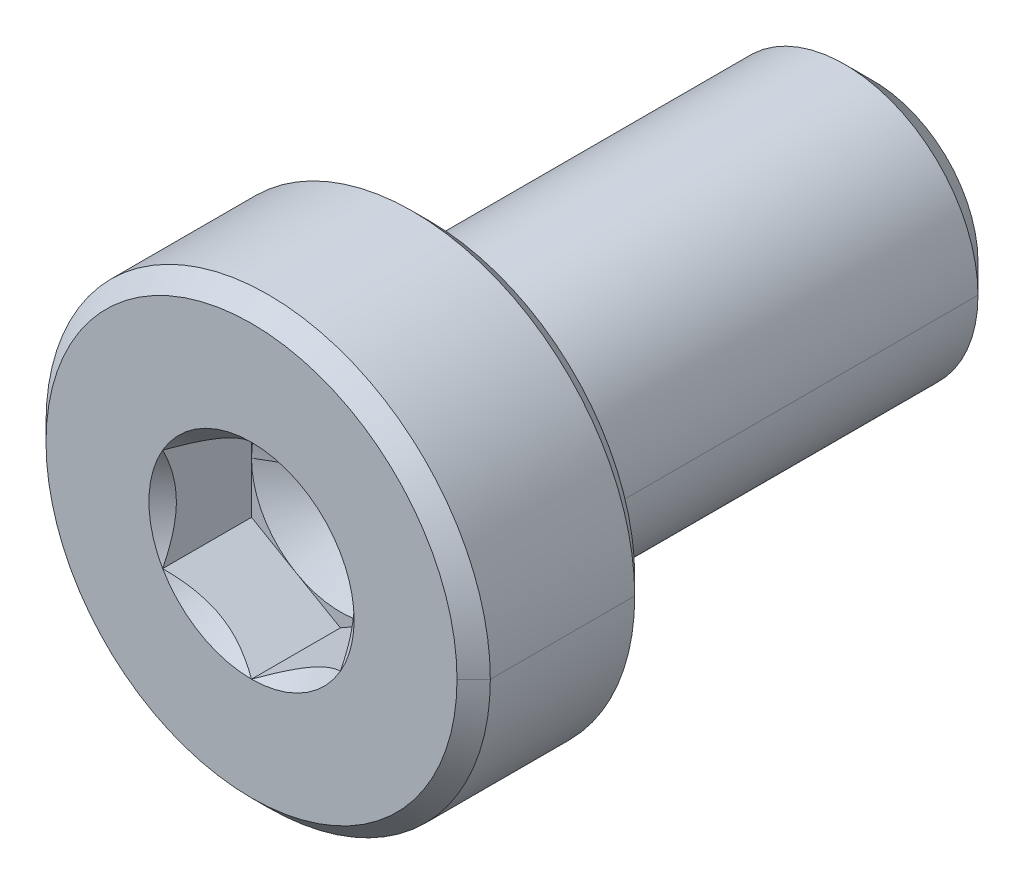
ISO-10303-21;
HEADER;
FILE_DESCRIPTION(('STEP AP214'),'2;1');
FILE_NAME('part.step','',(''),(''),'','','');
FILE_SCHEMA(('AUTOMOTIVE_DESIGN { 1 0 10303 214 1 1 1 1 }'));
ENDSEC;
DATA;
#1=APPLICATION_CONTEXT('core data for automotive mechanical design processes');
#2=APPLICATION_PROTOCOL_DEFINITION('international standard','automotive_design',2000,#1);
#3=PRODUCT_CONTEXT('',#1,'mechanical');
#4=PRODUCT('Part','Part','',(#3));
#5=PRODUCT_RELATED_PRODUCT_CATEGORY('part','',(#4));
#6=PRODUCT_DEFINITION_FORMATION('','',#4);
#7=PRODUCT_DEFINITION_CONTEXT('part definition',#1,'design');
#8=PRODUCT_DEFINITION('design','',#6,#7);
#9=PRODUCT_DEFINITION_SHAPE('','',#8);
#10=(LENGTH_UNIT() NAMED_UNIT(*) SI_UNIT(.MILLI.,.METRE.));
#11=(NAMED_UNIT(*) PLANE_ANGLE_UNIT() SI_UNIT($,.RADIAN.));
#12=(NAMED_UNIT(*) SI_UNIT($,.STERADIAN.) SOLID_ANGLE_UNIT());
#13=UNCERTAINTY_MEASURE_WITH_UNIT(LENGTH_MEASURE(1.E-05),#10,'distance_accuracy_value','');
#14=(GEOMETRIC_REPRESENTATION_CONTEXT(3) GLOBAL_UNCERTAINTY_ASSIGNED_CONTEXT((#13)) GLOBAL_UNIT_ASSIGNED_CONTEXT((#10,
#11,#12)) REPRESENTATION_CONTEXT('',''));
#15=CARTESIAN_POINT('',(0.,0.,0.));
#16=DIRECTION('',(0.,0.,1.));
#17=DIRECTION('',(1.,0.,0.));
#18=AXIS2_PLACEMENT_3D('',#15,#16,#17);
#19=CARTESIAN_POINT('',(0.,0.,4.99999999999695));
#20=DIRECTION('',(0.,0.,0.999999999999951));
#21=DIRECTION('',(0.999999999999969,0.,0.));
#22=AXIS2_PLACEMENT_3D('',#19,#20,#21);
#23=CONICAL_SURFACE('',#22,2.,1.0471975511966);
#24=DIRECTION('',(-0.866025403784412,0.,0.499999999999976));
#25=VECTOR('',#24,1.);
#26=CARTESIAN_POINT('',(-2.00000000000004,0.,4.99999999999695));
#27=LINE('',#26,#25);
#28=CARTESIAN_POINT('',(0.,0.,3.84529946161771));
#29=VERTEX_POINT('',#28);
#30=CARTESIAN_POINT('',(-2.00000000000004,0.,4.99999999999695));
#31=VERTEX_POINT('',#30);
#32=EDGE_CURVE('E401',#29,#31,#27,.T.);
#33=ORIENTED_EDGE('',*,*,#32,.F.);
#34=DIRECTION('',(0.866025403784412,0.,0.499999999999976));
#35=VECTOR('',#34,1.);
#36=CARTESIAN_POINT('',(1.99999999999997,0.,4.99999999999695));
#37=LINE('',#36,#35);
#38=CARTESIAN_POINT('',(1.99999999999997,0.,4.99999999999695));
#39=VERTEX_POINT('',#38);
#40=EDGE_CURVE('E403',#29,#39,#37,.T.);
#41=ORIENTED_EDGE('',*,*,#40,.T.);
#42=CARTESIAN_POINT('',(0.,0.,4.99999999999695));
#43=DIRECTION('',(0.,0.,0.999999999999951));
#44=DIRECTION('',(0.999999999999969,0.,0.));
#45=AXIS2_PLACEMENT_3D('',#42,#43,#44);
#46=CIRCLE('',#45,2.);
#47=CARTESIAN_POINT('',(0.999999999999987,1.73205080756891,4.99999999999695));
#48=VERTEX_POINT('',#47);
#49=EDGE_CURVE('E514',#39,#48,#46,.T.);
#50=ORIENTED_EDGE('',*,*,#49,.T.);
#51=CARTESIAN_POINT('',(0.,0.,4.99999999999695));
#52=DIRECTION('',(0.,0.,0.999999999999951));
#53=DIRECTION('',(0.999999999999969,0.,0.));
#54=AXIS2_PLACEMENT_3D('',#51,#52,#53);
#55=CIRCLE('',#54,2.);
#56=CARTESIAN_POINT('',(-1.00000000000004,1.73205080756887,4.99999999999695));
#57=VERTEX_POINT('',#56);
#58=EDGE_CURVE('E543',#48,#57,#55,.T.);
#59=ORIENTED_EDGE('',*,*,#58,.T.);
#60=CARTESIAN_POINT('',(0.,0.,4.99999999999695));
#61=DIRECTION('',(0.,0.,0.999999999999951));
#62=DIRECTION('',(0.999999999999969,0.,0.));
#63=AXIS2_PLACEMENT_3D('',#60,#61,#62);
#64=CIRCLE('',#63,2.);
#65=EDGE_CURVE('E405',#57,#31,#64,.T.);
#66=ORIENTED_EDGE('',*,*,#65,.T.);
#67=EDGE_LOOP('',(#33,#41,#50,#59,#66));
#68=FACE_BOUND('',#67,.T.);
#69=ADVANCED_FACE('F16',(#68),#23,.F.);
#70=CARTESIAN_POINT('',(0.,2.30940107675853,-1.11010092660778));
#71=DIRECTION('',(-0.499999999999985,0.866025403784411,0.));
#72=DIRECTION('',(0.,0.,0.999999999999951));
#73=AXIS2_PLACEMENT_3D('',#70,#71,#72);
#74=PLANE('',#73);
#75=DIRECTION('',(0.,0.,0.999999999999951));
#76=VECTOR('',#75,1.);
#77=CARTESIAN_POINT('',(0.,2.30940107675853,-1.11010092660778));
#78=LINE('',#77,#76);
#79=CARTESIAN_POINT('',(0.,2.30940107675853,4.99999999999695));
#80=VERTEX_POINT('',#79);
#81=CARTESIAN_POINT('',(0.,2.30940107675853,6.99999999999695));
#82=VERTEX_POINT('',#81);
#83=EDGE_CURVE('E292',#80,#82,#78,.T.);
#84=ORIENTED_EDGE('',*,*,#83,.T.);
#85=CARTESIAN_POINT('',(0.,2.30940107675853,6.99999999999961));
#86=CARTESIAN_POINT('',(-0.252681558770766,2.16351531078296,6.85411423402403));
#87=CARTESIAN_POINT('',(-0.481557611863528,2.03137365991879,6.77827147413491));
#88=CARTESIAN_POINT('',(-0.744004310413538,1.87984998786302,6.6913043944739));
#89=CARTESIAN_POINT('',(-0.996316959809336,1.7341772118144,6.69060344483097));
#90=CARTESIAN_POINT('',(-1.24817855174684,1.58876485391076,6.68990374827053));
#91=CARTESIAN_POINT('',(-1.51174853644636,1.43659265229418,6.77606819562888));
#92=CARTESIAN_POINT('',(-1.74318494981286,1.30297277673676,6.85172776164149));
#93=CARTESIAN_POINT('',(-1.99999999999982,1.15470053837937,6.99999999999961));
#94=B_SPLINE_CURVE_WITH_KNOTS('',2,(#85,#86,#87,#88,#89,#90,#91,#92,#93),.UNSPECIFIED.,.F.,.F.,
(3,2,2,2,3),(0.,0.25,0.5,0.75,1.),.UNSPECIFIED.);
#95=CARTESIAN_POINT('',(-2.00000000000001,1.15470053837926,6.99999999999695));
#96=VERTEX_POINT('',#95);
#97=EDGE_CURVE('E370',#82,#96,#94,.T.);
#98=ORIENTED_EDGE('',*,*,#97,.T.);
#99=DIRECTION('',(0.,0.,0.999999999999951));
#100=VECTOR('',#99,1.);
#101=CARTESIAN_POINT('',(-2.00000000000001,1.15470053837926,-1.11010092660778));
#102=LINE('',#101,#100);
#103=CARTESIAN_POINT('',(-2.00000000000001,1.15470053837926,4.99999999999695));
#104=VERTEX_POINT('',#103);
#105=EDGE_CURVE('E11',#104,#96,#102,.T.);
#106=ORIENTED_EDGE('',*,*,#105,.F.);
#107=DIRECTION('',(-0.866025403784411,-0.499999999999985,0.));
#108=VECTOR('',#107,1.);
#109=CARTESIAN_POINT('',(0.,2.30940107675853,4.99999999999695));
#110=LINE('',#109,#108);
#111=EDGE_CURVE('E535',#57,#104,#110,.T.);
#112=ORIENTED_EDGE('',*,*,#111,.F.);
#113=DIRECTION('',(-0.866025403784411,-0.499999999999985,0.));
#114=VECTOR('',#113,1.);
#115=CARTESIAN_POINT('',(0.,2.30940107675853,4.99999999999695));
#116=LINE('',#115,#114);
#117=EDGE_CURVE('E539',#80,#57,#116,.T.);
#118=ORIENTED_EDGE('',*,*,#117,.F.);
#119=EDGE_LOOP('',(#84,#98,#106,#112,#118));
#120=FACE_BOUND('',#119,.T.);
#121=ADVANCED_FACE('F351',(#120),#74,.F.);
#122=CARTESIAN_POINT('',(-2.00000000000001,1.15470053837926,-1.11010092660778));
#123=DIRECTION('',(-0.999999999999969,0.,0.));
#124=DIRECTION('',(0.,0.,0.999999999999951));
#125=AXIS2_PLACEMENT_3D('',#122,#123,#124);
#126=PLANE('',#125);
#127=ORIENTED_EDGE('',*,*,#105,.T.);
#128=CARTESIAN_POINT('',(-2.00000000000001,1.15470053837926,6.99999999999961));
#129=CARTESIAN_POINT('',(-2.00000000000001,0.860775765360554,6.85303761349025));
#130=CARTESIAN_POINT('',(-2.00000000000001,0.594672386083979,6.77713558641546));
#131=CARTESIAN_POINT('',(-2.00000000000001,0.291707804399723,6.69071945015964));
#132=CARTESIAN_POINT('',(-2.00000000000001,0.000273152028484706,6.69059894189413));
#133=CARTESIAN_POINT('',(-2.00000000000001,-0.290224908780214,6.69047882090934));
#134=CARTESIAN_POINT('',(-2.00000000000001,-0.594364421607488,6.77704783602882));
#135=CARTESIAN_POINT('',(-2.00000000000001,-0.860034914941372,6.85266718828076));
#136=CARTESIAN_POINT('',(-2.00000000000001,-1.15470053837905,6.99999999999961));
#137=B_SPLINE_CURVE_WITH_KNOTS('',2,(#128,#129,#130,#131,#132,#133,#134,#135,#136),
.UNSPECIFIED.,.F.,.F.,(3,2,2,2,3),(0.,0.25,0.5,0.75,1.),.UNSPECIFIED.);
#138=CARTESIAN_POINT('',(-2.00000000000005,-1.15470053837923,6.99999999999695));
#139=VERTEX_POINT('',#138);
#140=EDGE_CURVE('E337',#96,#139,#137,.T.);
#141=ORIENTED_EDGE('',*,*,#140,.T.);
#142=DIRECTION('',(0.,0.,0.999999999999951));
#143=VECTOR('',#142,1.);
#144=CARTESIAN_POINT('',(-2.00000000000005,-1.15470053837923,-1.11010092660778));
#145=LINE('',#144,#143);
#146=CARTESIAN_POINT('',(-2.00000000000005,-1.15470053837923,4.99999999999695));
#147=VERTEX_POINT('',#146);
#148=EDGE_CURVE('E27',#147,#139,#145,.T.);
#149=ORIENTED_EDGE('',*,*,#148,.F.);
#150=DIRECTION('',(0.,-0.999999999999969,0.));
#151=VECTOR('',#150,1.);
#152=CARTESIAN_POINT('',(-2.00000000000001,1.15470053837926,4.99999999999695));
#153=LINE('',#152,#151);
#154=EDGE_CURVE('E576',#31,#147,#153,.T.);
#155=ORIENTED_EDGE('',*,*,#154,.F.);
#156=DIRECTION('',(0.,-0.999999999999969,0.));
#157=VECTOR('',#156,1.);
#158=CARTESIAN_POINT('',(-2.00000000000001,1.15470053837926,4.99999999999695));
#159=LINE('',#158,#157);
#160=EDGE_CURVE('E438',#104,#31,#159,.T.);
#161=ORIENTED_EDGE('',*,*,#160,.F.);
#162=EDGE_LOOP('',(#127,#141,#149,#155,#161));
#163=FACE_BOUND('',#162,.T.);
#164=ADVANCED_FACE('F343',(#163),#126,.F.);
#165=CARTESIAN_POINT('',(-2.00000000000005,-1.15470053837923,-1.11010092660778));
#166=DIRECTION('',(-0.499999999999982,-0.86602540378441,0.));
#167=DIRECTION('',(-0.86602540378441,0.499999999999982,0.));
#168=AXIS2_PLACEMENT_3D('',#165,#166,#167);
#169=PLANE('',#168);
#170=ORIENTED_EDGE('',*,*,#148,.T.);
#171=CARTESIAN_POINT('',(-2.00000000000005,-1.15470053837923,6.99999999999946));
#172=CARTESIAN_POINT('',(-1.74731844122762,-1.30058630435575,6.85411423402295));
#173=CARTESIAN_POINT('',(-1.51844238813648,-1.43272795521898,6.77827147413477));
#174=CARTESIAN_POINT('',(-1.25599568958434,-1.58425162727598,6.69130439447351));
#175=CARTESIAN_POINT('',(-1.00368304019065,-1.72992440332338,6.69060344483082));
#176=CARTESIAN_POINT('',(-0.751821448250733,-1.87533676122841,6.68990374827062));
#177=CARTESIAN_POINT('',(-0.488251463553595,-2.02750896284361,6.77606819562872));
#178=CARTESIAN_POINT('',(-0.256815050185137,-2.16112883840217,6.85172776164248));
#179=CARTESIAN_POINT('',(-1.18394877235417E-13,-2.30940107675844,6.99999999999946));
#180=B_SPLINE_CURVE_WITH_KNOTS('',2,(#171,#172,#173,#174,#175,#176,#177,#178,#179),
.UNSPECIFIED.,.F.,.F.,(3,2,2,2,3),(0.,0.25,0.5,0.75,1.),.UNSPECIFIED.);
#181=CARTESIAN_POINT('',(0.,-2.30940107675844,6.99999999999695));
#182=VERTEX_POINT('',#181);
#183=EDGE_CURVE('E588',#139,#182,#180,.T.);
#184=ORIENTED_EDGE('',*,*,#183,.T.);
#185=DIRECTION('',(0.,0.,0.999999999999951));
#186=VECTOR('',#185,1.);
#187=CARTESIAN_POINT('',(0.,-2.30940107675844,-1.11010092660778));
#188=LINE('',#187,#186);
#189=CARTESIAN_POINT('',(0.,-2.30940107675844,4.99999999999695));
#190=VERTEX_POINT('',#189);
#191=EDGE_CURVE('E51',#190,#182,#188,.T.);
#192=ORIENTED_EDGE('',*,*,#191,.F.);
#193=DIRECTION('',(0.86602540378441,-0.499999999999982,0.));
#194=VECTOR('',#193,1.);
#195=CARTESIAN_POINT('',(-2.00000000000005,-1.15470053837923,4.99999999999695));
#196=LINE('',#195,#194);
#197=CARTESIAN_POINT('',(-1.,-1.73205080756885,4.99999999999695));
#198=VERTEX_POINT('',#197);
#199=EDGE_CURVE('E494',#198,#190,#196,.T.);
#200=ORIENTED_EDGE('',*,*,#199,.F.);
#201=DIRECTION('',(0.86602540378441,-0.499999999999982,0.));
#202=VECTOR('',#201,1.);
#203=CARTESIAN_POINT('',(-2.00000000000005,-1.15470053837923,4.99999999999695));
#204=LINE('',#203,#202);
#205=EDGE_CURVE('E574',#147,#198,#204,.T.);
#206=ORIENTED_EDGE('',*,*,#205,.F.);
#207=EDGE_LOOP('',(#170,#184,#192,#200,#206));
#208=FACE_BOUND('',#207,.T.);
#209=ADVANCED_FACE('F242',(#208),#169,.F.);
#210=CARTESIAN_POINT('',(0.,-2.30940107675844,-1.11010092660778));
#211=DIRECTION('',(0.499999999999985,-0.866025403784411,0.));
#212=DIRECTION('',(0.,0.,-0.999999999999951));
#213=AXIS2_PLACEMENT_3D('',#210,#211,#212);
#214=PLANE('',#213);
#215=ORIENTED_EDGE('',*,*,#191,.T.);
#216=CARTESIAN_POINT('',(0.,-2.30940107675844,6.99999999999961));
#217=CARTESIAN_POINT('',(0.252681558770543,-2.16351531078297,6.85411423402413));
#218=CARTESIAN_POINT('',(0.481557611863471,-2.03137365991871,6.77827147413492));
#219=CARTESIAN_POINT('',(0.744004310414773,-1.87984998786218,6.69130439447343));
#220=CARTESIAN_POINT('',(0.996316959809279,-1.73417721181432,6.69060344483097));
#221=CARTESIAN_POINT('',(1.24817855174836,-1.58876485390976,6.689903748271));
#222=CARTESIAN_POINT('',(1.51174853644631,-1.4365926522941,6.77606819562888));
#223=CARTESIAN_POINT('',(1.74318494981297,-1.30297277673657,6.85172776164159));
#224=CARTESIAN_POINT('',(1.99999999999976,-1.15470053837928,6.99999999999961));
#225=B_SPLINE_CURVE_WITH_KNOTS('',2,(#216,#217,#218,#219,#220,#221,#222,#223,#224),
.UNSPECIFIED.,.F.,.F.,(3,2,2,2,3),(0.,0.25,0.5,0.75,1.),.UNSPECIFIED.);
#226=CARTESIAN_POINT('',(1.99999999999995,-1.15470053837924,6.99999999999695));
#227=VERTEX_POINT('',#226);
#228=EDGE_CURVE('E206',#182,#227,#225,.T.);
#229=ORIENTED_EDGE('',*,*,#228,.T.);
#230=DIRECTION('',(0.,0.,0.999999999999951));
#231=VECTOR('',#230,1.);
#232=CARTESIAN_POINT('',(1.99999999999995,-1.15470053837924,-1.11010092660778));
#233=LINE('',#232,#231);
#234=CARTESIAN_POINT('',(1.99999999999995,-1.15470053837924,4.99999999999695));
#235=VERTEX_POINT('',#234);
#236=EDGE_CURVE('E201',#235,#227,#233,.T.);
#237=ORIENTED_EDGE('',*,*,#236,.F.);
#238=DIRECTION('',(0.866025403784411,0.499999999999985,0.));
#239=VECTOR('',#238,1.);
#240=CARTESIAN_POINT('',(0.,-2.30940107675844,4.99999999999695));
#241=LINE('',#240,#239);
#242=CARTESIAN_POINT('',(0.99999999999998,-1.73205080756885,4.99999999999695));
#243=VERTEX_POINT('',#242);
#244=EDGE_CURVE('E478',#243,#235,#241,.T.);
#245=ORIENTED_EDGE('',*,*,#244,.F.);
#246=DIRECTION('',(0.866025403784411,0.499999999999985,0.));
#247=VECTOR('',#246,1.);
#248=CARTESIAN_POINT('',(0.,-2.30940107675844,4.99999999999695));
#249=LINE('',#248,#247);
#250=EDGE_CURVE('E482',#190,#243,#249,.T.);
#251=ORIENTED_EDGE('',*,*,#250,.F.);
#252=EDGE_LOOP('',(#215,#229,#237,#245,#251));
#253=FACE_BOUND('',#252,.T.);
#254=ADVANCED_FACE('F239',(#253),#214,.F.);
#255=CARTESIAN_POINT('',(1.99999999999995,-1.15470053837924,-1.11010092660778));
#256=DIRECTION('',(0.999999999999966,0.,0.));
#257=DIRECTION('',(0.,0.999999999999966,0.));
#258=AXIS2_PLACEMENT_3D('',#255,#256,#257);
#259=PLANE('',#258);
#260=ORIENTED_EDGE('',*,*,#236,.T.);
#261=CARTESIAN_POINT('',(1.99999999999995,-1.15470053837924,6.99999999999945));
#262=CARTESIAN_POINT('',(1.99999999999995,-0.860679270469703,6.85298936604469));
#263=CARTESIAN_POINT('',(1.99999999999995,-0.594494067362542,6.77708477177414));
#264=CARTESIAN_POINT('',(1.99999999999995,-0.291202107515584,6.69059892324097));
#265=CARTESIAN_POINT('',(1.99999999999995,0.,6.69059892324097));
#266=B_SPLINE_CURVE_WITH_KNOTS('',2,(#261,#262,#263,#264,#265),.UNSPECIFIED.,.F.,.F.,(3,2,3),
(0.,0.5,1.),.UNSPECIFIED.);
#267=CARTESIAN_POINT('',(1.99999999999997,0.,6.69059892323845));
#268=VERTEX_POINT('',#267);
#269=EDGE_CURVE('E193',#227,#268,#266,.T.);
#270=ORIENTED_EDGE('',*,*,#269,.T.);
#271=CARTESIAN_POINT('',(1.99999999999995,0.,6.69059892324097));
#272=CARTESIAN_POINT('',(1.99999999999995,0.29073084190147,6.69059892324097));
#273=CARTESIAN_POINT('',(1.99999999999995,0.594542348646187,6.77709852888046));
#274=CARTESIAN_POINT('',(1.99999999999995,0.860132367703118,6.85271591466143));
#275=CARTESIAN_POINT('',(1.99999999999995,1.15470053837919,6.99999999999945));
#276=B_SPLINE_CURVE_WITH_KNOTS('',2,(#271,#272,#273,#274,#275),.UNSPECIFIED.,.F.,.F.,(3,2,3),
(0.,0.5,1.),.UNSPECIFIED.);
#277=CARTESIAN_POINT('',(2.,1.15470053837925,6.99999999999695));
#278=VERTEX_POINT('',#277);
#279=EDGE_CURVE('E198',#268,#278,#276,.T.);
#280=ORIENTED_EDGE('',*,*,#279,.T.);
#281=DIRECTION('',(0.,0.,0.999999999999951));
#282=VECTOR('',#281,1.);
#283=CARTESIAN_POINT('',(2.,1.15470053837925,-1.11010092660778));
#284=LINE('',#283,#282);
#285=CARTESIAN_POINT('',(2.,1.15470053837925,4.99999999999695));
#286=VERTEX_POINT('',#285);
#287=EDGE_CURVE('E584',#286,#278,#284,.T.);
#288=ORIENTED_EDGE('',*,*,#287,.F.);
#289=DIRECTION('',(0.,0.999999999999966,0.));
#290=VECTOR('',#289,1.);
#291=CARTESIAN_POINT('',(1.99999999999995,-1.15470053837924,4.99999999999695));
#292=LINE('',#291,#290);
#293=EDGE_CURVE('E551',#39,#286,#292,.T.);
#294=ORIENTED_EDGE('',*,*,#293,.F.);
#295=DIRECTION('',(0.,0.999999999999966,0.));
#296=VECTOR('',#295,1.);
#297=CARTESIAN_POINT('',(1.99999999999995,-1.15470053837924,4.99999999999695));
#298=LINE('',#297,#296);
#299=EDGE_CURVE('E483',#235,#39,#298,.T.);
#300=ORIENTED_EDGE('',*,*,#299,.F.);
#301=EDGE_LOOP('',(#260,#270,#280,#288,#294,#300));
#302=FACE_BOUND('',#301,.T.);
#303=ADVANCED_FACE('F196',(#302),#259,.F.);
#304=CARTESIAN_POINT('',(2.,1.15470053837925,-1.11010092660778));
#305=DIRECTION('',(0.499999999999982,0.86602540378441,0.));
#306=DIRECTION('',(0.,0.,-0.999999999999951));
#307=AXIS2_PLACEMENT_3D('',#304,#305,#306);
#308=PLANE('',#307);
#309=ORIENTED_EDGE('',*,*,#287,.T.);
#310=CARTESIAN_POINT('',(2.,1.15470053837925,6.99999999999961));
#311=CARTESIAN_POINT('',(1.74731844122912,1.30058630435487,6.85411423402398));
#312=CARTESIAN_POINT('',(1.51844238813645,1.43272795521899,6.77827147413491));
#313=CARTESIAN_POINT('',(1.25599568958706,1.5842516272744,6.69130439447413));
#314=CARTESIAN_POINT('',(1.00368304019064,1.72992440332337,6.69060344483097));
#315=CARTESIAN_POINT('',(0.751821448252164,1.87533676122758,6.6899037482703));
#316=CARTESIAN_POINT('',(0.48825146355362,2.02750896284359,6.77606819562888));
#317=CARTESIAN_POINT('',(0.256815050185156,2.16112883840215,6.85172776164263));
#318=CARTESIAN_POINT('',(1.6306400674182E-13,2.30940107675841,6.99999999999961));
#319=B_SPLINE_CURVE_WITH_KNOTS('',2,(#310,#311,#312,#313,#314,#315,#316,#317,#318),
.UNSPECIFIED.,.F.,.F.,(3,2,2,2,3),(0.,0.25,0.5,0.75,1.),.UNSPECIFIED.);
#320=EDGE_CURVE('E207',#278,#82,#319,.T.);
#321=ORIENTED_EDGE('',*,*,#320,.T.);
#322=ORIENTED_EDGE('',*,*,#83,.F.);
#323=DIRECTION('',(-0.86602540378441,0.499999999999982,0.));
#324=VECTOR('',#323,1.);
#325=CARTESIAN_POINT('',(2.,1.15470053837925,4.99999999999695));
#326=LINE('',#325,#324);
#327=EDGE_CURVE('E515',#48,#80,#326,.T.);
#328=ORIENTED_EDGE('',*,*,#327,.F.);
#329=DIRECTION('',(-0.86602540378441,0.499999999999982,0.));
#330=VECTOR('',#329,1.);
#331=CARTESIAN_POINT('',(2.,1.15470053837925,4.99999999999695));
#332=LINE('',#331,#330);
#333=EDGE_CURVE('E510',#286,#48,#332,.T.);
#334=ORIENTED_EDGE('',*,*,#333,.F.);
#335=EDGE_LOOP('',(#309,#321,#322,#328,#334));
#336=FACE_BOUND('',#335,.T.);
#337=ADVANCED_FACE('F238',(#336),#308,.F.);
#338=CARTESIAN_POINT('',(0.,2.00000000000002,4.99999999999695));
#339=DIRECTION('',(0.,0.,-0.999999999999951));
#340=DIRECTION('',(0.,-0.999999999999969,0.));
#341=AXIS2_PLACEMENT_3D('',#338,#339,#340);
#342=PLANE('',#341);
#343=ORIENTED_EDGE('',*,*,#205,.T.);
#344=CARTESIAN_POINT('',(0.,0.,4.99999999999695));
#345=DIRECTION('',(0.,0.,0.999999999999951));
#346=DIRECTION('',(0.999999999999969,0.,0.));
#347=AXIS2_PLACEMENT_3D('',#344,#345,#346);
#348=CIRCLE('',#347,2.);
#349=EDGE_CURVE('E410',#31,#198,#348,.T.);
#350=ORIENTED_EDGE('',*,*,#349,.F.);
#351=ORIENTED_EDGE('',*,*,#154,.T.);
#352=EDGE_LOOP('',(#343,#350,#351));
#353=FACE_BOUND('',#352,.T.);
#354=ADVANCED_FACE('F385',(#353),#342,.F.);
#355=CARTESIAN_POINT('',(0.,0.,6.99999999999695));
#356=DIRECTION('',(0.,0.,0.999999999999951));
#357=DIRECTION('',(0.999999999999969,0.,0.));
#358=AXIS2_PLACEMENT_3D('',#355,#356,#357);
#359=CONICAL_SURFACE('',#358,2.3094010767585,0.78539816339745);
#360=CARTESIAN_POINT('',(0.,0.,6.99999999999695));
#361=DIRECTION('',(0.,0.,0.999999999999951));
#362=DIRECTION('',(0.999999999999969,0.,0.));
#363=AXIS2_PLACEMENT_3D('',#360,#361,#362);
#364=CIRCLE('',#363,2.3094010767585);
#365=EDGE_CURVE('E307',#82,#96,#364,.T.);
#366=ORIENTED_EDGE('',*,*,#365,.T.);
#367=ORIENTED_EDGE('',*,*,#97,.F.);
#368=EDGE_LOOP('',(#366,#367));
#369=FACE_BOUND('',#368,.T.);
#370=ADVANCED_FACE('F375',(#369),#359,.F.);
#371=CARTESIAN_POINT('',(0.,0.,6.99999999999695));
#372=DIRECTION('',(0.,0.,0.999999999999951));
#373=DIRECTION('',(0.999999999999969,0.,0.));
#374=AXIS2_PLACEMENT_3D('',#371,#372,#373);
#375=CONICAL_SURFACE('',#374,2.3094010767585,0.78539816339745);
#376=CARTESIAN_POINT('',(0.,0.,6.99999999999695));
#377=DIRECTION('',(0.,0.,0.999999999999951));
#378=DIRECTION('',(0.999999999999969,0.,0.));
#379=AXIS2_PLACEMENT_3D('',#376,#377,#378);
#380=CIRCLE('',#379,2.3094010767585);
#381=EDGE_CURVE('E317',#96,#139,#380,.T.);
#382=ORIENTED_EDGE('',*,*,#381,.T.);
#383=ORIENTED_EDGE('',*,*,#140,.F.);
#384=EDGE_LOOP('',(#382,#383));
#385=FACE_BOUND('',#384,.T.);
#386=ADVANCED_FACE('F384',(#385),#375,.F.);
#387=CARTESIAN_POINT('',(0.,0.,6.99999999999695));
#388=DIRECTION('',(0.,0.,0.999999999999951));
#389=DIRECTION('',(0.999999999999969,0.,0.));
#390=AXIS2_PLACEMENT_3D('',#387,#388,#389);
#391=CONICAL_SURFACE('',#390,2.3094010767585,0.78539816339745);
#392=CARTESIAN_POINT('',(0.,0.,6.99999999999695));
#393=DIRECTION('',(0.,0.,0.999999999999951));
#394=DIRECTION('',(0.999999999999969,0.,0.));
#395=AXIS2_PLACEMENT_3D('',#392,#393,#394);
#396=CIRCLE('',#395,2.3094010767585);
#397=EDGE_CURVE('E304',#139,#182,#396,.T.);
#398=ORIENTED_EDGE('',*,*,#397,.T.);
#399=ORIENTED_EDGE('',*,*,#183,.F.);
#400=EDGE_LOOP('',(#398,#399));
#401=FACE_BOUND('',#400,.T.);
#402=ADVANCED_FACE('F274',(#401),#391,.F.);
#403=CARTESIAN_POINT('',(0.,0.,6.99999999999695));
#404=DIRECTION('',(0.,0.,0.999999999999951));
#405=DIRECTION('',(0.999999999999969,0.,0.));
#406=AXIS2_PLACEMENT_3D('',#403,#404,#405);
#407=CONICAL_SURFACE('',#406,2.3094010767585,0.78539816339745);
#408=CARTESIAN_POINT('',(0.,0.,6.99999999999695));
#409=DIRECTION('',(0.,0.,0.999999999999951));
#410=DIRECTION('',(0.999999999999969,0.,0.));
#411=AXIS2_PLACEMENT_3D('',#408,#409,#410);
#412=CIRCLE('',#411,2.3094010767585);
#413=EDGE_CURVE('E296',#182,#227,#412,.T.);
#414=ORIENTED_EDGE('',*,*,#413,.T.);
#415=ORIENTED_EDGE('',*,*,#228,.F.);
#416=EDGE_LOOP('',(#414,#415));
#417=FACE_BOUND('',#416,.T.);
#418=ADVANCED_FACE('F268',(#417),#407,.F.);
#419=CARTESIAN_POINT('',(0.,0.,6.99999999999695));
#420=DIRECTION('',(0.,0.,0.999999999999951));
#421=DIRECTION('',(0.999999999999969,0.,0.));
#422=AXIS2_PLACEMENT_3D('',#419,#420,#421);
#423=CONICAL_SURFACE('',#422,2.3094010767585,0.78539816339745);
#424=DIRECTION('',(0.707106781186538,0.,0.707106781186497));
#425=VECTOR('',#424,1.);
#426=CARTESIAN_POINT('',(2.30940107675845,0.,6.99999999999695));
#427=LINE('',#426,#425);
#428=CARTESIAN_POINT('',(2.30940107675845,0.,6.99999999999695));
#429=VERTEX_POINT('',#428);
#430=EDGE_CURVE('E211',#268,#429,#427,.T.);
#431=ORIENTED_EDGE('',*,*,#430,.F.);
#432=ORIENTED_EDGE('',*,*,#269,.F.);
#433=CARTESIAN_POINT('',(0.,0.,6.99999999999695));
#434=DIRECTION('',(0.,0.,0.999999999999951));
#435=DIRECTION('',(0.999999999999969,0.,0.));
#436=AXIS2_PLACEMENT_3D('',#433,#434,#435);
#437=CIRCLE('',#436,2.3094010767585);
#438=EDGE_CURVE('E214',#227,#429,#437,.T.);
#439=ORIENTED_EDGE('',*,*,#438,.T.);
#440=EDGE_LOOP('',(#431,#432,#439));
#441=FACE_BOUND('',#440,.T.);
#442=ADVANCED_FACE('F212',(#441),#423,.F.);
#443=CARTESIAN_POINT('',(0.,0.,6.99999999999695));
#444=DIRECTION('',(0.,0.,0.999999999999951));
#445=DIRECTION('',(0.999999999999969,0.,0.));
#446=AXIS2_PLACEMENT_3D('',#443,#444,#445);
#447=CONICAL_SURFACE('',#446,2.3094010767585,0.78539816339745);
#448=CARTESIAN_POINT('',(0.,0.,6.99999999999695));
#449=DIRECTION('',(0.,0.,0.999999999999951));
#450=DIRECTION('',(0.999999999999969,0.,0.));
#451=AXIS2_PLACEMENT_3D('',#448,#449,#450);
#452=CIRCLE('',#451,2.3094010767585);
#453=EDGE_CURVE('E297',#278,#82,#452,.T.);
#454=ORIENTED_EDGE('',*,*,#453,.T.);
#455=ORIENTED_EDGE('',*,*,#320,.F.);
#456=EDGE_LOOP('',(#454,#455));
#457=FACE_BOUND('',#456,.T.);
#458=ADVANCED_FACE('F267',(#457),#447,.F.);
#459=CARTESIAN_POINT('',(0.,0.,6.62499999999695));
#460=DIRECTION('',(0.,0.,-0.999999999999951));
#461=DIRECTION('',(-0.999999999999969,0.,0.));
#462=AXIS2_PLACEMENT_3D('',#459,#460,#461);
#463=CONICAL_SURFACE('',#462,5.,0.785398163397445);
#464=DIRECTION('',(0.707106781186534,0.,-0.707106781186501));
#465=VECTOR('',#464,1.);
#466=CARTESIAN_POINT('',(4.99999999999999,0.,6.62499999999695));
#467=LINE('',#466,#465);
#468=CARTESIAN_POINT('',(4.62499999999998,0.,6.99999999999695));
#469=VERTEX_POINT('',#468);
#470=CARTESIAN_POINT('',(4.99999999999999,0.,6.62499999999695));
#471=VERTEX_POINT('',#470);
#472=EDGE_CURVE('E434',#469,#471,#467,.T.);
#473=ORIENTED_EDGE('',*,*,#472,.F.);
#474=CARTESIAN_POINT('',(0.,0.,6.99999999999695));
#475=DIRECTION('',(0.,0.,0.999999999999951));
#476=DIRECTION('',(0.999999999999969,0.,0.));
#477=AXIS2_PLACEMENT_3D('',#474,#475,#476);
#478=CIRCLE('',#477,4.625);
#479=CARTESIAN_POINT('',(-4.62500000000002,0.,6.99999999999695));
#480=VERTEX_POINT('',#479);
#481=EDGE_CURVE('E332',#480,#469,#478,.T.);
#482=ORIENTED_EDGE('',*,*,#481,.F.);
#483=DIRECTION('',(-0.707106781186534,0.,-0.707106781186501));
#484=VECTOR('',#483,1.);
#485=CARTESIAN_POINT('',(-5.,0.,6.62499999999695));
#486=LINE('',#485,#484);
#487=CARTESIAN_POINT('',(-5.,0.,6.62499999999695));
#488=VERTEX_POINT('',#487);
#489=EDGE_CURVE('E454',#480,#488,#486,.T.);
#490=ORIENTED_EDGE('',*,*,#489,.T.);
#491=CARTESIAN_POINT('',(0.,0.,6.62499999999695));
#492=DIRECTION('',(0.,0.,0.999999999999951));
#493=DIRECTION('',(0.999999999999969,0.,0.));
#494=AXIS2_PLACEMENT_3D('',#491,#492,#493);
#495=CIRCLE('',#494,5.);
#496=EDGE_CURVE('E532',#488,#471,#495,.T.);
#497=ORIENTED_EDGE('',*,*,#496,.T.);
#498=EDGE_LOOP('',(#473,#482,#490,#497));
#499=FACE_BOUND('',#498,.T.);
#500=ADVANCED_FACE('F1228',(#499),#463,.T.);
#501=CARTESIAN_POINT('',(0.,2.00000000000002,6.99999999999695));
#502=DIRECTION('',(0.,0.,-0.999999999999951));
#503=DIRECTION('',(0.,-0.999999999999969,0.));
#504=AXIS2_PLACEMENT_3D('',#501,#502,#503);
#505=PLANE('',#504);
#506=ORIENTED_EDGE('',*,*,#381,.F.);
#507=ORIENTED_EDGE('',*,*,#365,.F.);
#508=ORIENTED_EDGE('',*,*,#453,.F.);
#509=CARTESIAN_POINT('',(0.,0.,6.99999999999695));
#510=DIRECTION('',(0.,0.,0.999999999999951));
#511=DIRECTION('',(0.999999999999969,0.,0.));
#512=AXIS2_PLACEMENT_3D('',#509,#510,#511);
#513=CIRCLE('',#512,2.3094010767585);
#514=EDGE_CURVE('E219',#429,#278,#513,.T.);
#515=ORIENTED_EDGE('',*,*,#514,.F.);
#516=ORIENTED_EDGE('',*,*,#438,.F.);
#517=ORIENTED_EDGE('',*,*,#413,.F.);
#518=ORIENTED_EDGE('',*,*,#397,.F.);
#519=EDGE_LOOP('',(#506,#507,#508,#515,#516,#517,#518));
#520=FACE_BOUND('',#519,.T.);
#521=ORIENTED_EDGE('',*,*,#481,.T.);
#522=CARTESIAN_POINT('',(0.,0.,6.99999999999695));
#523=DIRECTION('',(0.,0.,0.999999999999951));
#524=DIRECTION('',(0.999999999999969,0.,0.));
#525=AXIS2_PLACEMENT_3D('',#522,#523,#524);
#526=CIRCLE('',#525,4.625);
#527=EDGE_CURVE('E430',#469,#480,#526,.T.);
#528=ORIENTED_EDGE('',*,*,#527,.T.);
#529=EDGE_LOOP('',(#521,#528));
#530=FACE_BOUND('',#529,.T.);
#531=ADVANCED_FACE('F638',(#520,#530),#505,.F.);
#532=CARTESIAN_POINT('',(0.,0.,-7.));
#533=DIRECTION('',(0.,0.,0.999999999999951));
#534=DIRECTION('',(0.999999999999969,0.,0.));
#535=AXIS2_PLACEMENT_3D('',#532,#533,#534);
#536=PLANE('',#535);
#537=CARTESIAN_POINT('',(0.,0.,-7.));
#538=DIRECTION('',(0.,0.,0.999999999999951));
#539=DIRECTION('',(0.999999999999969,0.,0.));
#540=AXIS2_PLACEMENT_3D('',#537,#538,#539);
#541=CIRCLE('',#540,2.35048094716167);
#542=CARTESIAN_POINT('',(2.35048094716163,0.,-7.));
#543=VERTEX_POINT('',#542);
#544=CARTESIAN_POINT('',(-2.3504809471617,0.,-7.));
#545=VERTEX_POINT('',#544);
#546=EDGE_CURVE('E448',#543,#545,#541,.T.);
#547=ORIENTED_EDGE('',*,*,#546,.F.);
#548=CARTESIAN_POINT('',(0.,0.,-7.));
#549=DIRECTION('',(0.,0.,0.999999999999951));
#550=DIRECTION('',(0.999999999999969,0.,0.));
#551=AXIS2_PLACEMENT_3D('',#548,#549,#550);
#552=CIRCLE('',#551,2.35048094716167);
#553=EDGE_CURVE('E570',#545,#543,#552,.T.);
#554=ORIENTED_EDGE('',*,*,#553,.F.);
#555=EDGE_LOOP('',(#547,#554));
#556=FACE_BOUND('',#555,.T.);
#557=ADVANCED_FACE('F1205',(#556),#536,.F.);
#558=CARTESIAN_POINT('',(0.,0.,-7.));
#559=DIRECTION('',(0.,0.,0.999999999999951));
#560=DIRECTION('',(0.999999999999969,0.,0.));
#561=AXIS2_PLACEMENT_3D('',#558,#559,#560);
#562=CONICAL_SURFACE('',#561,2.35048094716167,0.785398163397445);
#563=DIRECTION('',(-0.707106781186543,0.,0.707106781186501));
#564=VECTOR('',#563,1.);
#565=CARTESIAN_POINT('',(-2.3504809471617,0.,-7.));
#566=LINE('',#565,#564);
#567=CARTESIAN_POINT('',(-3.00000000000006,0.,-6.35048094716167));
#568=VERTEX_POINT('',#567);
#569=EDGE_CURVE('E444',#545,#568,#566,.T.);
#570=ORIENTED_EDGE('',*,*,#569,.F.);
#571=ORIENTED_EDGE('',*,*,#553,.T.);
#572=DIRECTION('',(0.707106781186534,0.,0.707106781186501));
#573=VECTOR('',#572,1.);
#574=CARTESIAN_POINT('',(2.35048094716163,0.,-7.));
#575=LINE('',#574,#573);
#576=CARTESIAN_POINT('',(3.,0.,-6.35048094716167));
#577=VERTEX_POINT('',#576);
#578=EDGE_CURVE('E459',#543,#577,#575,.T.);
#579=ORIENTED_EDGE('',*,*,#578,.T.);
#580=CARTESIAN_POINT('',(0.,0.,-6.35048094716167));
#581=DIRECTION('',(0.,0.,0.999999999999951));
#582=DIRECTION('',(0.999999999999969,0.,0.));
#583=AXIS2_PLACEMENT_3D('',#580,#581,#582);
#584=CIRCLE('',#583,3.);
#585=EDGE_CURVE('E567',#568,#577,#584,.T.);
#586=ORIENTED_EDGE('',*,*,#585,.F.);
#587=EDGE_LOOP('',(#570,#571,#579,#586));
#588=FACE_BOUND('',#587,.T.);
#589=ADVANCED_FACE('F1193',(#588),#562,.T.);
#590=CARTESIAN_POINT('',(0.,0.,4.99999999999695));
#591=DIRECTION('',(0.,0.,0.999999999999951));
#592=DIRECTION('',(0.999999999999969,0.,0.));
#593=AXIS2_PLACEMENT_3D('',#590,#591,#592);
#594=CYLINDRICAL_SURFACE('',#593,3.);
#595=DIRECTION('',(0.,0.,0.999999999999951));
#596=VECTOR('',#595,1.);
#597=CARTESIAN_POINT('',(-3.00000000000006,0.,4.99999999999695));
#598=LINE('',#597,#596);
#599=CARTESIAN_POINT('',(-3.00000000000006,0.,2.7));
#600=VERTEX_POINT('',#599);
#601=EDGE_CURVE('E463',#568,#600,#598,.T.);
#602=ORIENTED_EDGE('',*,*,#601,.F.);
#603=ORIENTED_EDGE('',*,*,#585,.T.);
#604=DIRECTION('',(0.,0.,0.999999999999951));
#605=VECTOR('',#604,1.);
#606=CARTESIAN_POINT('',(3.,0.,4.99999999999695));
#607=LINE('',#606,#605);
#608=CARTESIAN_POINT('',(3.,0.,2.7));
#609=VERTEX_POINT('',#608);
#610=EDGE_CURVE('E487',#577,#609,#607,.T.);
#611=ORIENTED_EDGE('',*,*,#610,.T.);
#612=CARTESIAN_POINT('',(0.,0.,2.7));
#613=DIRECTION('',(0.,0.,0.999999999999951));
#614=DIRECTION('',(0.999999999999969,0.,0.));
#615=AXIS2_PLACEMENT_3D('',#612,#613,#614);
#616=CIRCLE('',#615,3.);
#617=EDGE_CURVE('E502',#600,#609,#616,.T.);
#618=ORIENTED_EDGE('',*,*,#617,.F.);
#619=EDGE_LOOP('',(#602,#603,#611,#618));
#620=FACE_BOUND('',#619,.T.);
#621=ADVANCED_FACE('F1181',(#620),#594,.T.);
#622=CARTESIAN_POINT('',(0.,0.,2.7));
#623=DIRECTION('',(0.,0.,0.999999999999951));
#624=DIRECTION('',(0.999999999999969,0.,0.));
#625=AXIS2_PLACEMENT_3D('',#622,#623,#624);
#626=TOROIDAL_SURFACE('',#625,3.3,0.3);
#627=CARTESIAN_POINT('',(-3.30000000000002,0.,2.7));
#628=DIRECTION('',(0.,0.999999999999969,0.));
#629=DIRECTION('',(-0.999999999999969,0.,0.));
#630=AXIS2_PLACEMENT_3D('',#627,#628,#629);
#631=CIRCLE('',#630,0.3);
#632=CARTESIAN_POINT('',(-3.30000000000002,0.,3.));
#633=VERTEX_POINT('',#632);
#634=EDGE_CURVE('E498',#633,#600,#631,.T.);
#635=ORIENTED_EDGE('',*,*,#634,.F.);
#636=CARTESIAN_POINT('',(0.,0.,3.));
#637=DIRECTION('',(0.,0.,0.999999999999951));
#638=DIRECTION('',(0.999999999999969,0.,0.));
#639=AXIS2_PLACEMENT_3D('',#636,#637,#638);
#640=CIRCLE('',#639,3.3);
#641=CARTESIAN_POINT('',(3.29999999999991,0.,3.));
#642=VERTEX_POINT('',#641);
#643=EDGE_CURVE('E531',#642,#633,#640,.T.);
#644=ORIENTED_EDGE('',*,*,#643,.F.);
#645=CARTESIAN_POINT('',(3.29999999999991,0.,2.7));
#646=DIRECTION('',(0.,-0.999999999999969,0.));
#647=DIRECTION('',(0.,0.,-0.999999999999951));
#648=AXIS2_PLACEMENT_3D('',#645,#646,#647);
#649=CIRCLE('',#648,0.3);
#650=EDGE_CURVE('E506',#642,#609,#649,.T.);
#651=ORIENTED_EDGE('',*,*,#650,.T.);
#652=CARTESIAN_POINT('',(0.,0.,2.7));
#653=DIRECTION('',(0.,0.,0.999999999999951));
#654=DIRECTION('',(0.999999999999969,0.,0.));
#655=AXIS2_PLACEMENT_3D('',#652,#653,#654);
#656=CIRCLE('',#655,3.);
#657=EDGE_CURVE('E477',#609,#600,#656,.T.);
#658=ORIENTED_EDGE('',*,*,#657,.T.);
#659=EDGE_LOOP('',(#635,#644,#651,#658));
#660=FACE_BOUND('',#659,.T.);
#661=ADVANCED_FACE('F1043',(#660),#626,.F.);
#662=CARTESIAN_POINT('',(0.,3.30000000000002,3.));
#663=DIRECTION('',(0.,0.,0.999999999999951));
#664=DIRECTION('',(0.999999999999969,0.,0.));
#665=AXIS2_PLACEMENT_3D('',#662,#663,#664);
#666=PLANE('',#665);
#667=ORIENTED_EDGE('',*,*,#643,.T.);
#668=CARTESIAN_POINT('',(0.,0.,3.));
#669=DIRECTION('',(0.,0.,0.999999999999951));
#670=DIRECTION('',(0.999999999999969,0.,0.));
#671=AXIS2_PLACEMENT_3D('',#668,#669,#670);
#672=CIRCLE('',#671,3.3);
#673=EDGE_CURVE('E491',#633,#642,#672,.T.);
#674=ORIENTED_EDGE('',*,*,#673,.T.);
#675=EDGE_LOOP('',(#667,#674));
#676=FACE_BOUND('',#675,.T.);
#677=CARTESIAN_POINT('',(0.,0.,3.));
#678=DIRECTION('',(0.,0.,0.999999999999951));
#679=DIRECTION('',(0.999999999999969,0.,0.));
#680=AXIS2_PLACEMENT_3D('',#677,#678,#679);
#681=CIRCLE('',#680,4.625);
#682=CARTESIAN_POINT('',(4.62499999999998,0.,3.));
#683=VERTEX_POINT('',#682);
#684=CARTESIAN_POINT('',(-4.62500000000002,0.,3.));
#685=VERTEX_POINT('',#684);
#686=EDGE_CURVE('E509',#683,#685,#681,.T.);
#687=ORIENTED_EDGE('',*,*,#686,.F.);
#688=CARTESIAN_POINT('',(0.,0.,3.));
#689=DIRECTION('',(0.,0.,0.999999999999951));
#690=DIRECTION('',(0.999999999999969,0.,0.));
#691=AXIS2_PLACEMENT_3D('',#688,#689,#690);
#692=CIRCLE('',#691,4.625);
#693=EDGE_CURVE('E528',#685,#683,#692,.T.);
#694=ORIENTED_EDGE('',*,*,#693,.F.);
#695=EDGE_LOOP('',(#687,#694));
#696=FACE_BOUND('',#695,.T.);
#697=ADVANCED_FACE('F1038',(#676,#696),#666,.F.);
#698=CARTESIAN_POINT('',(0.,0.,3.));
#699=DIRECTION('',(0.,0.,0.999999999999951));
#700=DIRECTION('',(0.999999999999969,0.,0.));
#701=AXIS2_PLACEMENT_3D('',#698,#699,#700);
#702=CONICAL_SURFACE('',#701,4.625,0.785398163397448);
#703=DIRECTION('',(-0.707106781186536,0.,0.707106781186499));
#704=VECTOR('',#703,1.);
#705=CARTESIAN_POINT('',(-4.62500000000002,0.,3.));
#706=LINE('',#705,#704);
#707=CARTESIAN_POINT('',(-5.,0.,3.37499999999695));
#708=VERTEX_POINT('',#707);
#709=EDGE_CURVE('E429',#685,#708,#706,.T.);
#710=ORIENTED_EDGE('',*,*,#709,.F.);
#711=ORIENTED_EDGE('',*,*,#693,.T.);
#712=DIRECTION('',(0.707106781186536,0.,0.707106781186499));
#713=VECTOR('',#712,1.);
#714=CARTESIAN_POINT('',(4.62499999999998,0.,3.));
#715=LINE('',#714,#713);
#716=CARTESIAN_POINT('',(4.99999999999999,0.,3.37499999999695));
#717=VERTEX_POINT('',#716);
#718=EDGE_CURVE('E428',#683,#717,#715,.T.);
#719=ORIENTED_EDGE('',*,*,#718,.T.);
#720=CARTESIAN_POINT('',(0.,0.,3.37499999999695));
#721=DIRECTION('',(0.,0.,0.999999999999951));
#722=DIRECTION('',(0.999999999999969,0.,0.));
#723=AXIS2_PLACEMENT_3D('',#720,#721,#722);
#724=CIRCLE('',#723,5.);
#725=EDGE_CURVE('E554',#708,#717,#724,.T.);
#726=ORIENTED_EDGE('',*,*,#725,.F.);
#727=EDGE_LOOP('',(#710,#711,#719,#726));
#728=FACE_BOUND('',#727,.T.);
#729=ADVANCED_FACE('F994',(#728),#702,.T.);
#730=CARTESIAN_POINT('',(0.,0.,4.99999999999695));
#731=DIRECTION('',(0.,0.,0.999999999999951));
#732=DIRECTION('',(0.999999999999969,0.,0.));
#733=AXIS2_PLACEMENT_3D('',#730,#731,#732);
#734=CYLINDRICAL_SURFACE('',#733,5.);
#735=DIRECTION('',(0.,0.,0.999999999999951));
#736=VECTOR('',#735,1.);
#737=CARTESIAN_POINT('',(-5.,0.,4.99999999999695));
#738=LINE('',#737,#736);
#739=EDGE_CURVE('E467',#708,#488,#738,.T.);
#740=ORIENTED_EDGE('',*,*,#739,.F.);
#741=ORIENTED_EDGE('',*,*,#725,.T.);
#742=DIRECTION('',(0.,0.,0.999999999999951));
#743=VECTOR('',#742,1.);
#744=CARTESIAN_POINT('',(4.99999999999999,0.,4.99999999999695));
#745=LINE('',#744,#743);
#746=EDGE_CURVE('E441',#717,#471,#745,.T.);
#747=ORIENTED_EDGE('',*,*,#746,.T.);
#748=ORIENTED_EDGE('',*,*,#496,.F.);
#749=EDGE_LOOP('',(#740,#741,#747,#748));
#750=FACE_BOUND('',#749,.T.);
#751=ADVANCED_FACE('F988',(#750),#734,.T.);
#752=CARTESIAN_POINT('',(0.,2.00000000000002,4.99999999999695));
#753=DIRECTION('',(0.,0.,-0.999999999999951));
#754=DIRECTION('',(0.,-0.999999999999969,0.));
#755=AXIS2_PLACEMENT_3D('',#752,#753,#754);
#756=PLANE('',#755);
#757=ORIENTED_EDGE('',*,*,#250,.T.);
#758=CARTESIAN_POINT('',(0.,0.,4.99999999999695));
#759=DIRECTION('',(0.,0.,0.999999999999951));
#760=DIRECTION('',(0.999999999999969,0.,0.));
#761=AXIS2_PLACEMENT_3D('',#758,#759,#760);
#762=CIRCLE('',#761,2.);
#763=EDGE_CURVE('E437',#198,#243,#762,.T.);
#764=ORIENTED_EDGE('',*,*,#763,.F.);
#765=ORIENTED_EDGE('',*,*,#199,.T.);
#766=EDGE_LOOP('',(#757,#764,#765));
#767=FACE_BOUND('',#766,.T.);
#768=ADVANCED_FACE('F993',(#767),#756,.F.);
#769=CARTESIAN_POINT('',(0.,2.00000000000002,4.99999999999695));
#770=DIRECTION('',(0.,0.,-0.999999999999951));
#771=DIRECTION('',(0.,-0.999999999999969,0.));
#772=AXIS2_PLACEMENT_3D('',#769,#770,#771);
#773=PLANE('',#772);
#774=ORIENTED_EDGE('',*,*,#299,.T.);
#775=CARTESIAN_POINT('',(0.,0.,4.99999999999695));
#776=DIRECTION('',(0.,0.,0.999999999999951));
#777=DIRECTION('',(0.999999999999969,0.,0.));
#778=AXIS2_PLACEMENT_3D('',#775,#776,#777);
#779=CIRCLE('',#778,2.);
#780=EDGE_CURVE('E223',#243,#39,#779,.T.);
#781=ORIENTED_EDGE('',*,*,#780,.F.);
#782=ORIENTED_EDGE('',*,*,#244,.T.);
#783=EDGE_LOOP('',(#774,#781,#782));
#784=FACE_BOUND('',#783,.T.);
#785=ADVANCED_FACE('F1086',(#784),#773,.F.);
#786=CARTESIAN_POINT('',(0.,2.00000000000002,4.99999999999695));
#787=DIRECTION('',(0.,0.,-0.999999999999951));
#788=DIRECTION('',(0.,-0.999999999999969,0.));
#789=AXIS2_PLACEMENT_3D('',#786,#787,#788);
#790=PLANE('',#789);
#791=ORIENTED_EDGE('',*,*,#333,.T.);
#792=ORIENTED_EDGE('',*,*,#49,.F.);
#793=ORIENTED_EDGE('',*,*,#293,.T.);
#794=EDGE_LOOP('',(#791,#792,#793));
#795=FACE_BOUND('',#794,.T.);
#796=ADVANCED_FACE('F1091',(#795),#790,.F.);
#797=CARTESIAN_POINT('',(0.,2.00000000000002,4.99999999999695));
#798=DIRECTION('',(0.,0.,-0.999999999999951));
#799=DIRECTION('',(0.,-0.999999999999969,0.));
#800=AXIS2_PLACEMENT_3D('',#797,#798,#799);
#801=PLANE('',#800);
#802=ORIENTED_EDGE('',*,*,#117,.T.);
#803=ORIENTED_EDGE('',*,*,#58,.F.);
#804=ORIENTED_EDGE('',*,*,#327,.T.);
#805=EDGE_LOOP('',(#802,#803,#804));
#806=FACE_BOUND('',#805,.T.);
#807=ADVANCED_FACE('F1139',(#806),#801,.F.);
#808=CARTESIAN_POINT('',(0.,2.00000000000002,4.99999999999695));
#809=DIRECTION('',(0.,0.,-0.999999999999951));
#810=DIRECTION('',(0.,-0.999999999999969,0.));
#811=AXIS2_PLACEMENT_3D('',#808,#809,#810);
#812=PLANE('',#811);
#813=ORIENTED_EDGE('',*,*,#160,.T.);
#814=ORIENTED_EDGE('',*,*,#65,.F.);
#815=ORIENTED_EDGE('',*,*,#111,.T.);
#816=EDGE_LOOP('',(#813,#814,#815));
#817=FACE_BOUND('',#816,.T.);
#818=ADVANCED_FACE('F1127',(#817),#812,.F.);
#819=CARTESIAN_POINT('',(0.,0.,4.99999999999695));
#820=DIRECTION('',(0.,0.,0.999999999999951));
#821=DIRECTION('',(0.999999999999969,0.,0.));
#822=AXIS2_PLACEMENT_3D('',#819,#820,#821);
#823=CYLINDRICAL_SURFACE('',#822,5.);
#824=CARTESIAN_POINT('',(0.,0.,3.37499999999695));
#825=DIRECTION('',(0.,0.,0.999999999999951));
#826=DIRECTION('',(0.999999999999969,0.,0.));
#827=AXIS2_PLACEMENT_3D('',#824,#825,#826);
#828=CIRCLE('',#827,5.);
#829=EDGE_CURVE('E424',#717,#708,#828,.T.);
#830=ORIENTED_EDGE('',*,*,#829,.T.);
#831=ORIENTED_EDGE('',*,*,#739,.T.);
#832=CARTESIAN_POINT('',(0.,0.,6.62499999999695));
#833=DIRECTION('',(0.,0.,0.999999999999951));
#834=DIRECTION('',(0.999999999999969,0.,0.));
#835=AXIS2_PLACEMENT_3D('',#832,#833,#834);
#836=CIRCLE('',#835,5.);
#837=EDGE_CURVE('E458',#471,#488,#836,.T.);
#838=ORIENTED_EDGE('',*,*,#837,.F.);
#839=ORIENTED_EDGE('',*,*,#746,.F.);
#840=EDGE_LOOP('',(#830,#831,#838,#839));
#841=FACE_BOUND('',#840,.T.);
#842=ADVANCED_FACE('F1105',(#841),#823,.T.);
#843=CARTESIAN_POINT('',(0.,0.,3.));
#844=DIRECTION('',(0.,0.,0.999999999999951));
#845=DIRECTION('',(0.999999999999969,0.,0.));
#846=AXIS2_PLACEMENT_3D('',#843,#844,#845);
#847=CONICAL_SURFACE('',#846,4.625,0.785398163397448);
#848=ORIENTED_EDGE('',*,*,#686,.T.);
#849=ORIENTED_EDGE('',*,*,#709,.T.);
#850=ORIENTED_EDGE('',*,*,#829,.F.);
#851=ORIENTED_EDGE('',*,*,#718,.F.);
#852=EDGE_LOOP('',(#848,#849,#850,#851));
#853=FACE_BOUND('',#852,.T.);
#854=ADVANCED_FACE('F1100',(#853),#847,.T.);
#855=CARTESIAN_POINT('',(0.,0.,2.7));
#856=DIRECTION('',(0.,0.,0.999999999999951));
#857=DIRECTION('',(0.999999999999969,0.,0.));
#858=AXIS2_PLACEMENT_3D('',#855,#856,#857);
#859=TOROIDAL_SURFACE('',#858,3.3,0.3);
#860=ORIENTED_EDGE('',*,*,#673,.F.);
#861=ORIENTED_EDGE('',*,*,#634,.T.);
#862=ORIENTED_EDGE('',*,*,#617,.T.);
#863=ORIENTED_EDGE('',*,*,#650,.F.);
#864=EDGE_LOOP('',(#860,#861,#862,#863));
#865=FACE_BOUND('',#864,.T.);
#866=ADVANCED_FACE('F1077',(#865),#859,.F.);
#867=CARTESIAN_POINT('',(0.,0.,4.99999999999695));
#868=DIRECTION('',(0.,0.,0.999999999999951));
#869=DIRECTION('',(0.999999999999969,0.,0.));
#870=AXIS2_PLACEMENT_3D('',#867,#868,#869);
#871=CYLINDRICAL_SURFACE('',#870,3.);
#872=CARTESIAN_POINT('',(0.,0.,-6.35048094716167));
#873=DIRECTION('',(0.,0.,0.999999999999951));
#874=DIRECTION('',(0.999999999999969,0.,0.));
#875=AXIS2_PLACEMENT_3D('',#872,#873,#874);
#876=CIRCLE('',#875,3.);
#877=EDGE_CURVE('E421',#577,#568,#876,.T.);
#878=ORIENTED_EDGE('',*,*,#877,.T.);
#879=ORIENTED_EDGE('',*,*,#601,.T.);
#880=ORIENTED_EDGE('',*,*,#657,.F.);
#881=ORIENTED_EDGE('',*,*,#610,.F.);
#882=EDGE_LOOP('',(#878,#879,#880,#881));
#883=FACE_BOUND('',#882,.T.);
#884=ADVANCED_FACE('F1065',(#883),#871,.T.);
#885=CARTESIAN_POINT('',(0.,0.,-7.));
#886=DIRECTION('',(0.,0.,0.999999999999951));
#887=DIRECTION('',(0.999999999999969,0.,0.));
#888=AXIS2_PLACEMENT_3D('',#885,#886,#887);
#889=CONICAL_SURFACE('',#888,2.35048094716167,0.785398163397445);
#890=ORIENTED_EDGE('',*,*,#546,.T.);
#891=ORIENTED_EDGE('',*,*,#569,.T.);
#892=ORIENTED_EDGE('',*,*,#877,.F.);
#893=ORIENTED_EDGE('',*,*,#578,.F.);
#894=EDGE_LOOP('',(#890,#891,#892,#893));
#895=FACE_BOUND('',#894,.T.);
#896=ADVANCED_FACE('F1029',(#895),#889,.T.);
#897=CARTESIAN_POINT('',(0.,0.,6.62499999999695));
#898=DIRECTION('',(0.,0.,-0.999999999999951));
#899=DIRECTION('',(-0.999999999999969,0.,0.));
#900=AXIS2_PLACEMENT_3D('',#897,#898,#899);
#901=CONICAL_SURFACE('',#900,5.,0.785398163397445);
#902=ORIENTED_EDGE('',*,*,#527,.F.);
#903=ORIENTED_EDGE('',*,*,#472,.T.);
#904=ORIENTED_EDGE('',*,*,#837,.T.);
#905=ORIENTED_EDGE('',*,*,#489,.F.);
#906=EDGE_LOOP('',(#902,#903,#904,#905));
#907=FACE_BOUND('',#906,.T.);
#908=ADVANCED_FACE('F1019',(#907),#901,.T.);
#909=CARTESIAN_POINT('',(0.,0.,6.99999999999695));
#910=DIRECTION('',(0.,0.,0.999999999999951));
#911=DIRECTION('',(0.999999999999969,0.,0.));
#912=AXIS2_PLACEMENT_3D('',#909,#910,#911);
#913=CONICAL_SURFACE('',#912,2.3094010767585,0.78539816339745);
#914=ORIENTED_EDGE('',*,*,#279,.F.);
#915=ORIENTED_EDGE('',*,*,#430,.T.);
#916=ORIENTED_EDGE('',*,*,#514,.T.);
#917=EDGE_LOOP('',(#914,#915,#916));
#918=FACE_BOUND('',#917,.T.);
#919=ADVANCED_FACE('F221',(#918),#913,.F.);
#920=CARTESIAN_POINT('',(0.,0.,4.99999999999695));
#921=DIRECTION('',(0.,0.,0.999999999999951));
#922=DIRECTION('',(0.999999999999969,0.,0.));
#923=AXIS2_PLACEMENT_3D('',#920,#921,#922);
#924=CONICAL_SURFACE('',#923,2.,1.0471975511966);
#925=ORIENTED_EDGE('',*,*,#40,.F.);
#926=ORIENTED_EDGE('',*,*,#32,.T.);
#927=ORIENTED_EDGE('',*,*,#349,.T.);
#928=ORIENTED_EDGE('',*,*,#763,.T.);
#929=ORIENTED_EDGE('',*,*,#780,.T.);
#930=EDGE_LOOP('',(#925,#926,#927,#928,#929));
#931=FACE_BOUND('',#930,.T.);
#932=ADVANCED_FACE('F413',(#931),#924,.F.);
#933=CLOSED_SHELL('',(#69,#121,#164,#209,#254,#303,#337,#354,#370,#386,#402,#418,#442,#458,#500,
#531,#557,#589,#621,#661,#697,#729,#751,#768,#785,#796,#807,#818,#842,#854,#866,#884,#896,#908,
#919,#932));
#934=MANIFOLD_SOLID_BREP('B1',#933);
#935=ADVANCED_BREP_SHAPE_REPRESENTATION('',(#18,#934),#14);
#936=SHAPE_DEFINITION_REPRESENTATION(#9,#935);
ENDSEC;
END-ISO-10303-21;
